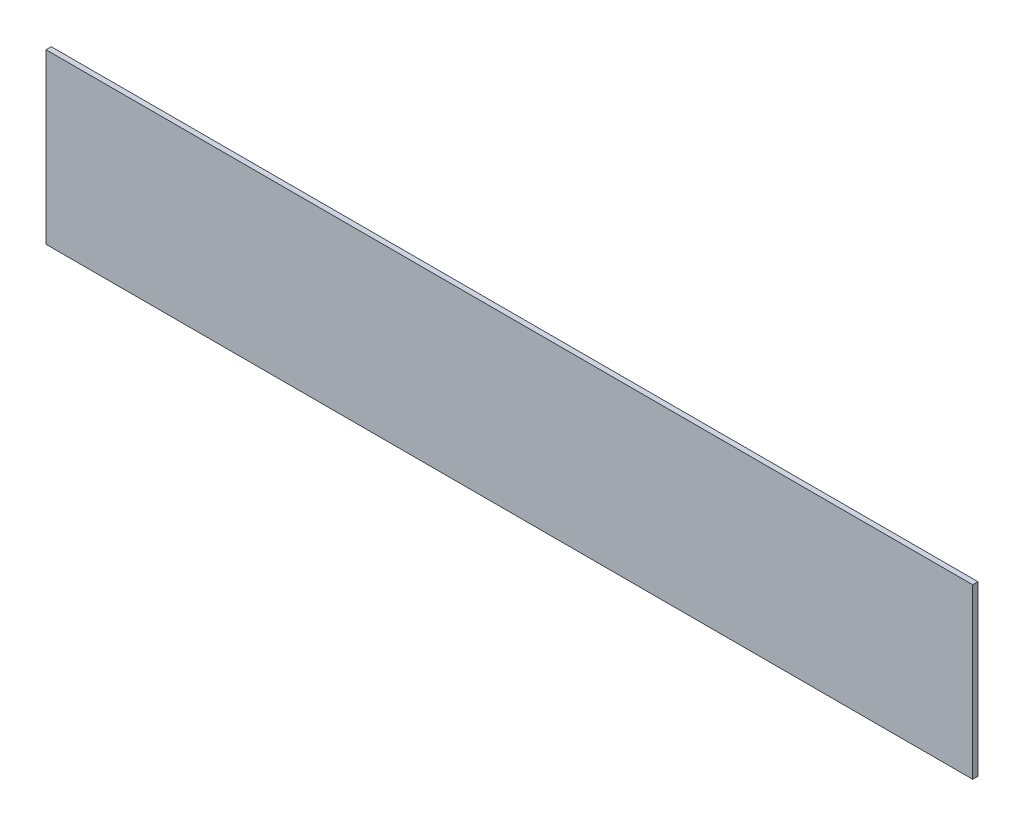
ISO-10303-21;
HEADER;
FILE_DESCRIPTION(('STEP AP214'),'2;1');
FILE_NAME('part.step','',(''),(''),'','','');
FILE_SCHEMA(('AUTOMOTIVE_DESIGN { 1 0 10303 214 1 1 1 1 }'));
ENDSEC;
DATA;
#1=APPLICATION_CONTEXT('core data for automotive mechanical design processes');
#2=APPLICATION_PROTOCOL_DEFINITION('international standard','automotive_design',2000,#1);
#3=PRODUCT_CONTEXT('',#1,'mechanical');
#4=PRODUCT('Part','Part','',(#3));
#5=PRODUCT_RELATED_PRODUCT_CATEGORY('part','',(#4));
#6=PRODUCT_DEFINITION_FORMATION('','',#4);
#7=PRODUCT_DEFINITION_CONTEXT('part definition',#1,'design');
#8=PRODUCT_DEFINITION('design','',#6,#7);
#9=PRODUCT_DEFINITION_SHAPE('','',#8);
#10=(LENGTH_UNIT() NAMED_UNIT(*) SI_UNIT(.MILLI.,.METRE.));
#11=(NAMED_UNIT(*) PLANE_ANGLE_UNIT() SI_UNIT($,.RADIAN.));
#12=(NAMED_UNIT(*) SI_UNIT($,.STERADIAN.) SOLID_ANGLE_UNIT());
#13=UNCERTAINTY_MEASURE_WITH_UNIT(LENGTH_MEASURE(1.E-05),#10,'distance_accuracy_value','');
#14=(GEOMETRIC_REPRESENTATION_CONTEXT(3) GLOBAL_UNCERTAINTY_ASSIGNED_CONTEXT((#13)) GLOBAL_UNIT_ASSIGNED_CONTEXT((#10,
#11,#12)) REPRESENTATION_CONTEXT('',''));
#15=CARTESIAN_POINT('',(0.,0.,0.));
#16=DIRECTION('',(0.,0.,1.));
#17=DIRECTION('',(1.,0.,0.));
#18=AXIS2_PLACEMENT_3D('',#15,#16,#17);
#19=CARTESIAN_POINT('',(0.,0.,1.5875));
#20=DIRECTION('',(0.,1.,0.));
#21=DIRECTION('',(0.,0.,1.));
#22=AXIS2_PLACEMENT_3D('',#19,#20,#21);
#23=PLANE('',#22);
#24=DIRECTION('',(1.,0.,0.));
#25=VECTOR('',#24,1.);
#26=CARTESIAN_POINT('',(0.,0.,0.));
#27=LINE('',#26,#25);
#28=CARTESIAN_POINT('',(0.,0.,0.));
#29=VERTEX_POINT('',#28);
#30=CARTESIAN_POINT('',(279.4,0.,0.));
#31=VERTEX_POINT('',#30);
#32=EDGE_CURVE('E97',#29,#31,#27,.T.);
#33=ORIENTED_EDGE('',*,*,#32,.T.);
#34=DIRECTION('',(0.,0.,-1.));
#35=VECTOR('',#34,1.);
#36=CARTESIAN_POINT('',(279.4,0.,1.5875));
#37=LINE('',#36,#35);
#38=CARTESIAN_POINT('',(279.4,0.,1.5875));
#39=VERTEX_POINT('',#38);
#40=EDGE_CURVE('E11',#39,#31,#37,.T.);
#41=ORIENTED_EDGE('',*,*,#40,.F.);
#42=DIRECTION('',(1.,0.,0.));
#43=VECTOR('',#42,1.);
#44=CARTESIAN_POINT('',(0.,0.,1.5875));
#45=LINE('',#44,#43);
#46=CARTESIAN_POINT('',(0.,0.,1.5875));
#47=VERTEX_POINT('',#46);
#48=EDGE_CURVE('E85',#47,#39,#45,.T.);
#49=ORIENTED_EDGE('',*,*,#48,.F.);
#50=DIRECTION('',(0.,0.,-1.));
#51=VECTOR('',#50,1.);
#52=CARTESIAN_POINT('',(0.,0.,1.5875));
#53=LINE('',#52,#51);
#54=EDGE_CURVE('E93',#47,#29,#53,.T.);
#55=ORIENTED_EDGE('',*,*,#54,.T.);
#56=EDGE_LOOP('',(#33,#41,#49,#55));
#57=FACE_BOUND('',#56,.T.);
#58=ADVANCED_FACE('F34',(#57),#23,.F.);
#59=CARTESIAN_POINT('',(279.4,0.,1.5875));
#60=DIRECTION('',(-1.,0.,0.));
#61=DIRECTION('',(0.,0.,1.));
#62=AXIS2_PLACEMENT_3D('',#59,#60,#61);
#63=PLANE('',#62);
#64=DIRECTION('',(0.,1.,0.));
#65=VECTOR('',#64,1.);
#66=CARTESIAN_POINT('',(279.4,0.,0.));
#67=LINE('',#66,#65);
#68=CARTESIAN_POINT('',(279.4,50.8,0.));
#69=VERTEX_POINT('',#68);
#70=EDGE_CURVE('E89',#31,#69,#67,.T.);
#71=ORIENTED_EDGE('',*,*,#70,.T.);
#72=DIRECTION('',(0.,0.,-1.));
#73=VECTOR('',#72,1.);
#74=CARTESIAN_POINT('',(279.4,50.8,1.5875));
#75=LINE('',#74,#73);
#76=CARTESIAN_POINT('',(279.4,50.8,1.5875));
#77=VERTEX_POINT('',#76);
#78=EDGE_CURVE('E42',#77,#69,#75,.T.);
#79=ORIENTED_EDGE('',*,*,#78,.F.);
#80=DIRECTION('',(0.,1.,0.));
#81=VECTOR('',#80,1.);
#82=CARTESIAN_POINT('',(279.4,0.,1.5875));
#83=LINE('',#82,#81);
#84=EDGE_CURVE('E80',#39,#77,#83,.T.);
#85=ORIENTED_EDGE('',*,*,#84,.F.);
#86=ORIENTED_EDGE('',*,*,#40,.T.);
#87=EDGE_LOOP('',(#71,#79,#85,#86));
#88=FACE_BOUND('',#87,.T.);
#89=ADVANCED_FACE('F88',(#88),#63,.F.);
#90=CARTESIAN_POINT('',(0.,50.8,1.5875));
#91=DIRECTION('',(0.,-1.,0.));
#92=DIRECTION('',(0.,0.,-1.));
#93=AXIS2_PLACEMENT_3D('',#90,#91,#92);
#94=PLANE('',#93);
#95=DIRECTION('',(-1.,0.,0.));
#96=VECTOR('',#95,1.);
#97=CARTESIAN_POINT('',(0.,50.8,0.));
#98=LINE('',#97,#96);
#99=CARTESIAN_POINT('',(0.,50.8,0.));
#100=VERTEX_POINT('',#99);
#101=EDGE_CURVE('E67',#69,#100,#98,.T.);
#102=ORIENTED_EDGE('',*,*,#101,.T.);
#103=DIRECTION('',(0.,0.,-1.));
#104=VECTOR('',#103,1.);
#105=CARTESIAN_POINT('',(0.,50.8,1.5875));
#106=LINE('',#105,#104);
#107=CARTESIAN_POINT('',(0.,50.8,1.5875));
#108=VERTEX_POINT('',#107);
#109=EDGE_CURVE('E90',#108,#100,#106,.T.);
#110=ORIENTED_EDGE('',*,*,#109,.F.);
#111=DIRECTION('',(-1.,0.,0.));
#112=VECTOR('',#111,1.);
#113=CARTESIAN_POINT('',(0.,50.8,1.5875));
#114=LINE('',#113,#112);
#115=EDGE_CURVE('E83',#77,#108,#114,.T.);
#116=ORIENTED_EDGE('',*,*,#115,.F.);
#117=ORIENTED_EDGE('',*,*,#78,.T.);
#118=EDGE_LOOP('',(#102,#110,#116,#117));
#119=FACE_BOUND('',#118,.T.);
#120=ADVANCED_FACE('F91',(#119),#94,.F.);
#121=CARTESIAN_POINT('',(0.,0.,1.5875));
#122=DIRECTION('',(1.,0.,0.));
#123=DIRECTION('',(0.,0.,-1.));
#124=AXIS2_PLACEMENT_3D('',#121,#122,#123);
#125=PLANE('',#124);
#126=DIRECTION('',(0.,-1.,0.));
#127=VECTOR('',#126,1.);
#128=CARTESIAN_POINT('',(0.,0.,0.));
#129=LINE('',#128,#127);
#130=EDGE_CURVE('E73',#100,#29,#129,.T.);
#131=ORIENTED_EDGE('',*,*,#130,.T.);
#132=ORIENTED_EDGE('',*,*,#54,.F.);
#133=DIRECTION('',(0.,-1.,0.));
#134=VECTOR('',#133,1.);
#135=CARTESIAN_POINT('',(0.,0.,1.5875));
#136=LINE('',#135,#134);
#137=EDGE_CURVE('E50',#108,#47,#136,.T.);
#138=ORIENTED_EDGE('',*,*,#137,.F.);
#139=ORIENTED_EDGE('',*,*,#109,.T.);
#140=EDGE_LOOP('',(#131,#132,#138,#139));
#141=FACE_BOUND('',#140,.T.);
#142=ADVANCED_FACE('F104',(#141),#125,.F.);
#143=CARTESIAN_POINT('',(0.,0.,1.5875));
#144=DIRECTION('',(0.,0.,1.));
#145=DIRECTION('',(1.,0.,0.));
#146=AXIS2_PLACEMENT_3D('',#143,#144,#145);
#147=PLANE('',#146);
#148=ORIENTED_EDGE('',*,*,#48,.T.);
#149=ORIENTED_EDGE('',*,*,#84,.T.);
#150=ORIENTED_EDGE('',*,*,#115,.T.);
#151=ORIENTED_EDGE('',*,*,#137,.T.);
#152=EDGE_LOOP('',(#148,#149,#150,#151));
#153=FACE_BOUND('',#152,.T.);
#154=ADVANCED_FACE('F81',(#153),#147,.T.);
#155=CARTESIAN_POINT('',(0.,0.,0.));
#156=DIRECTION('',(0.,0.,1.));
#157=DIRECTION('',(1.,0.,0.));
#158=AXIS2_PLACEMENT_3D('',#155,#156,#157);
#159=PLANE('',#158);
#160=ORIENTED_EDGE('',*,*,#32,.F.);
#161=ORIENTED_EDGE('',*,*,#130,.F.);
#162=ORIENTED_EDGE('',*,*,#101,.F.);
#163=ORIENTED_EDGE('',*,*,#70,.F.);
#164=EDGE_LOOP('',(#160,#161,#162,#163));
#165=FACE_BOUND('',#164,.T.);
#166=ADVANCED_FACE('F107',(#165),#159,.F.);
#167=CLOSED_SHELL('',(#58,#89,#120,#142,#154,#166));
#168=MANIFOLD_SOLID_BREP('B2',#167);
#169=ADVANCED_BREP_SHAPE_REPRESENTATION('',(#18,#168),#14);
#170=SHAPE_DEFINITION_REPRESENTATION(#9,#169);
ENDSEC;
END-ISO-10303-21;
